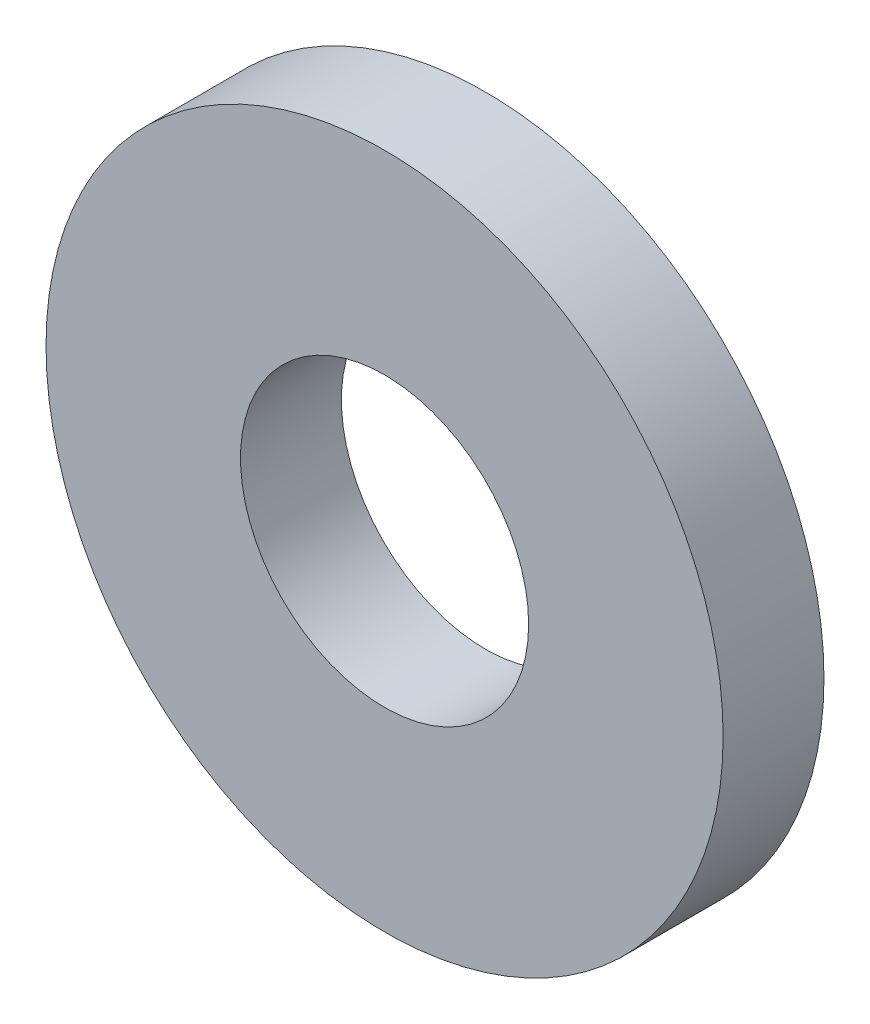
ISO-10303-21;
HEADER;
FILE_DESCRIPTION(('STEP AP214'),'2;1');
FILE_NAME('part.step','',(''),(''),'','','');
FILE_SCHEMA(('AUTOMOTIVE_DESIGN { 1 0 10303 214 1 1 1 1 }'));
ENDSEC;
DATA;
#1=APPLICATION_CONTEXT('core data for automotive mechanical design processes');
#2=APPLICATION_PROTOCOL_DEFINITION('international standard','automotive_design',2000,#1);
#3=PRODUCT_CONTEXT('',#1,'mechanical');
#4=PRODUCT('Part','Part','',(#3));
#5=PRODUCT_RELATED_PRODUCT_CATEGORY('part','',(#4));
#6=PRODUCT_DEFINITION_FORMATION('','',#4);
#7=PRODUCT_DEFINITION_CONTEXT('part definition',#1,'design');
#8=PRODUCT_DEFINITION('design','',#6,#7);
#9=PRODUCT_DEFINITION_SHAPE('','',#8);
#10=(LENGTH_UNIT() NAMED_UNIT(*) SI_UNIT(.MILLI.,.METRE.));
#11=(NAMED_UNIT(*) PLANE_ANGLE_UNIT() SI_UNIT($,.RADIAN.));
#12=(NAMED_UNIT(*) SI_UNIT($,.STERADIAN.) SOLID_ANGLE_UNIT());
#13=UNCERTAINTY_MEASURE_WITH_UNIT(LENGTH_MEASURE(1.E-05),#10,'distance_accuracy_value','');
#14=(GEOMETRIC_REPRESENTATION_CONTEXT(3) GLOBAL_UNCERTAINTY_ASSIGNED_CONTEXT((#13)) GLOBAL_UNIT_ASSIGNED_CONTEXT((#10,
#11,#12)) REPRESENTATION_CONTEXT('',''));
#15=CARTESIAN_POINT('',(0.,0.,0.));
#16=DIRECTION('',(0.,0.,1.));
#17=DIRECTION('',(1.,0.,0.));
#18=AXIS2_PLACEMENT_3D('',#15,#16,#17);
#19=CARTESIAN_POINT('',(0.,0.,0.));
#20=DIRECTION('',(0.,0.,1.));
#21=DIRECTION('',(1.,0.,0.));
#22=AXIS2_PLACEMENT_3D('',#19,#20,#21);
#23=CYLINDRICAL_SURFACE('',#22,23.5);
#24=CARTESIAN_POINT('',(0.,0.,-3.5));
#25=DIRECTION('',(0.,0.,1.));
#26=DIRECTION('',(1.,0.,0.));
#27=AXIS2_PLACEMENT_3D('',#24,#25,#26);
#28=CIRCLE('',#27,23.5);
#29=CARTESIAN_POINT('',(23.5,0.,-3.5));
#30=VERTEX_POINT('',#29);
#31=EDGE_CURVE('E10',#30,#30,#28,.T.);
#32=ORIENTED_EDGE('',*,*,#31,.T.);
#33=EDGE_LOOP('',(#32));
#34=FACE_BOUND('',#33,.T.);
#35=CARTESIAN_POINT('',(0.,0.,3.5));
#36=DIRECTION('',(0.,0.,1.));
#37=DIRECTION('',(1.,0.,0.));
#38=AXIS2_PLACEMENT_3D('',#35,#36,#37);
#39=CIRCLE('',#38,23.5);
#40=CARTESIAN_POINT('',(23.5,0.,3.5));
#41=VERTEX_POINT('',#40);
#42=EDGE_CURVE('E60',#41,#41,#39,.T.);
#43=ORIENTED_EDGE('',*,*,#42,.F.);
#44=EDGE_LOOP('',(#43));
#45=FACE_BOUND('',#44,.T.);
#46=ADVANCED_FACE('F43',(#34,#45),#23,.T.);
#47=CARTESIAN_POINT('',(9.99999999999998,0.,-3.5));
#48=DIRECTION('',(0.,0.,-1.));
#49=DIRECTION('',(-1.,0.,0.));
#50=AXIS2_PLACEMENT_3D('',#47,#48,#49);
#51=PLANE('',#50);
#52=CARTESIAN_POINT('',(0.,0.,-3.5));
#53=DIRECTION('',(0.,0.,1.));
#54=DIRECTION('',(1.,0.,0.));
#55=AXIS2_PLACEMENT_3D('',#52,#53,#54);
#56=CIRCLE('',#55,9.99999999999998);
#57=CARTESIAN_POINT('',(9.99999999999998,0.,-3.5));
#58=VERTEX_POINT('',#57);
#59=EDGE_CURVE('E50',#58,#58,#56,.T.);
#60=ORIENTED_EDGE('',*,*,#59,.T.);
#61=EDGE_LOOP('',(#60));
#62=FACE_BOUND('',#61,.T.);
#63=ORIENTED_EDGE('',*,*,#31,.F.);
#64=EDGE_LOOP('',(#63));
#65=FACE_BOUND('',#64,.T.);
#66=ADVANCED_FACE('F71',(#62,#65),#51,.T.);
#67=CARTESIAN_POINT('',(0.,0.,0.));
#68=DIRECTION('',(0.,0.,1.));
#69=DIRECTION('',(1.,0.,0.));
#70=AXIS2_PLACEMENT_3D('',#67,#68,#69);
#71=CYLINDRICAL_SURFACE('',#70,9.99999999999998);
#72=CARTESIAN_POINT('',(0.,0.,3.5));
#73=DIRECTION('',(0.,0.,1.));
#74=DIRECTION('',(1.,0.,0.));
#75=AXIS2_PLACEMENT_3D('',#72,#73,#74);
#76=CIRCLE('',#75,9.99999999999999);
#77=CARTESIAN_POINT('',(9.99999999999999,0.,3.5));
#78=VERTEX_POINT('',#77);
#79=EDGE_CURVE('E55',#78,#78,#76,.T.);
#80=ORIENTED_EDGE('',*,*,#79,.T.);
#81=EDGE_LOOP('',(#80));
#82=FACE_BOUND('',#81,.T.);
#83=ORIENTED_EDGE('',*,*,#59,.F.);
#84=EDGE_LOOP('',(#83));
#85=FACE_BOUND('',#84,.T.);
#86=ADVANCED_FACE('F75',(#82,#85),#71,.F.);
#87=CARTESIAN_POINT('',(9.99999999999999,0.,3.5));
#88=DIRECTION('',(0.,0.,1.));
#89=DIRECTION('',(1.,0.,0.));
#90=AXIS2_PLACEMENT_3D('',#87,#88,#89);
#91=PLANE('',#90);
#92=ORIENTED_EDGE('',*,*,#42,.T.);
#93=EDGE_LOOP('',(#92));
#94=FACE_BOUND('',#93,.T.);
#95=ORIENTED_EDGE('',*,*,#79,.F.);
#96=EDGE_LOOP('',(#95));
#97=FACE_BOUND('',#96,.T.);
#98=ADVANCED_FACE('F67',(#94,#97),#91,.T.);
#99=CLOSED_SHELL('',(#46,#66,#86,#98));
#100=MANIFOLD_SOLID_BREP('B2',#99);
#101=ADVANCED_BREP_SHAPE_REPRESENTATION('',(#18,#100),#14);
#102=SHAPE_DEFINITION_REPRESENTATION(#9,#101);
ENDSEC;
END-ISO-10303-21;
